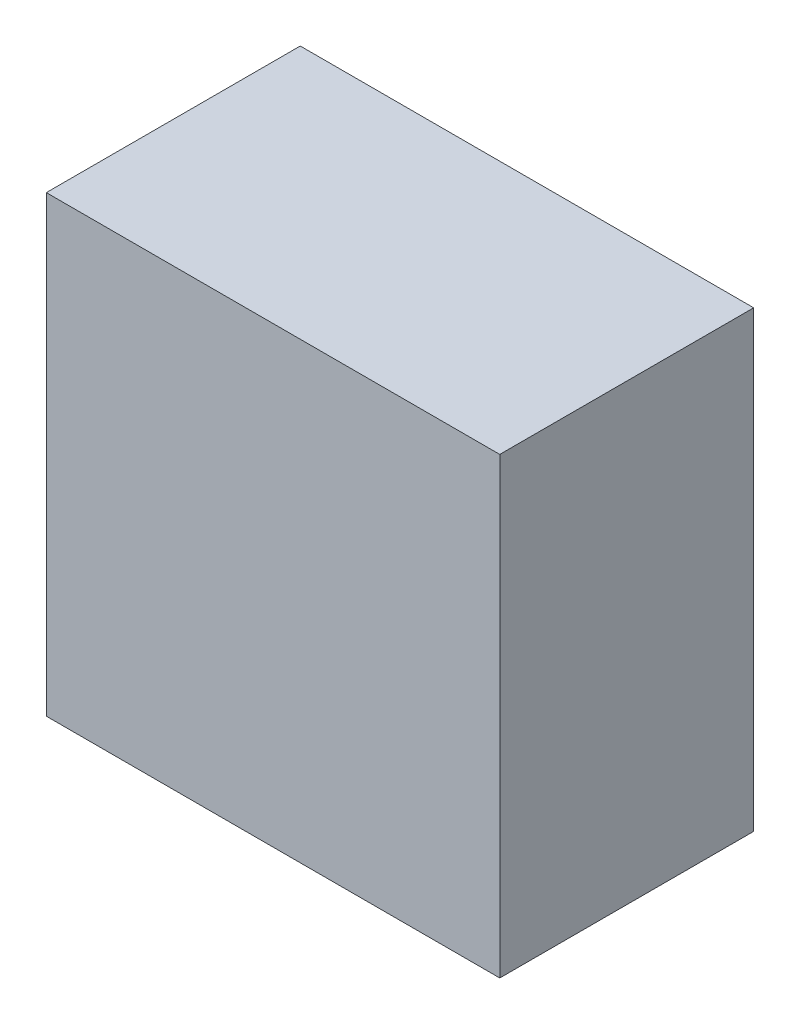
ISO-10303-21;
HEADER;
FILE_DESCRIPTION(('STEP AP214'),'2;1');
FILE_NAME('part.step','',(''),(''),'','','');
FILE_SCHEMA(('AUTOMOTIVE_DESIGN { 1 0 10303 214 1 1 1 1 }'));
ENDSEC;
DATA;
#1=APPLICATION_CONTEXT('core data for automotive mechanical design processes');
#2=APPLICATION_PROTOCOL_DEFINITION('international standard','automotive_design',2000,#1);
#3=PRODUCT_CONTEXT('',#1,'mechanical');
#4=PRODUCT('Part','Part','',(#3));
#5=PRODUCT_RELATED_PRODUCT_CATEGORY('part','',(#4));
#6=PRODUCT_DEFINITION_FORMATION('','',#4);
#7=PRODUCT_DEFINITION_CONTEXT('part definition',#1,'design');
#8=PRODUCT_DEFINITION('design','',#6,#7);
#9=PRODUCT_DEFINITION_SHAPE('','',#8);
#10=(LENGTH_UNIT() NAMED_UNIT(*) SI_UNIT(.MILLI.,.METRE.));
#11=(NAMED_UNIT(*) PLANE_ANGLE_UNIT() SI_UNIT($,.RADIAN.));
#12=(NAMED_UNIT(*) SI_UNIT($,.STERADIAN.) SOLID_ANGLE_UNIT());
#13=UNCERTAINTY_MEASURE_WITH_UNIT(LENGTH_MEASURE(1.E-05),#10,'distance_accuracy_value','');
#14=(GEOMETRIC_REPRESENTATION_CONTEXT(3) GLOBAL_UNCERTAINTY_ASSIGNED_CONTEXT((#13)) GLOBAL_UNIT_ASSIGNED_CONTEXT((#10,
#11,#12)) REPRESENTATION_CONTEXT('',''));
#15=CARTESIAN_POINT('',(0.,0.,0.));
#16=DIRECTION('',(0.,0.,1.));
#17=DIRECTION('',(1.,0.,0.));
#18=AXIS2_PLACEMENT_3D('',#15,#16,#17);
#19=CARTESIAN_POINT('',(62.5,62.5,35.));
#20=DIRECTION('',(-1.,0.,0.));
#21=DIRECTION('',(0.,-1.,0.));
#22=AXIS2_PLACEMENT_3D('',#19,#20,#21);
#23=PLANE('',#22);
#24=DIRECTION('',(0.,1.,0.));
#25=VECTOR('',#24,1.);
#26=CARTESIAN_POINT('',(62.5,62.5,-35.));
#27=LINE('',#26,#25);
#28=CARTESIAN_POINT('',(62.5,-62.5,-35.));
#29=VERTEX_POINT('',#28);
#30=CARTESIAN_POINT('',(62.5,62.5,-35.));
#31=VERTEX_POINT('',#30);
#32=EDGE_CURVE('E102',#29,#31,#27,.T.);
#33=ORIENTED_EDGE('',*,*,#32,.T.);
#34=DIRECTION('',(0.,0.,-1.));
#35=VECTOR('',#34,1.);
#36=CARTESIAN_POINT('',(62.5,62.5,35.));
#37=LINE('',#36,#35);
#38=CARTESIAN_POINT('',(62.5,62.5,35.));
#39=VERTEX_POINT('',#38);
#40=EDGE_CURVE('E11',#39,#31,#37,.T.);
#41=ORIENTED_EDGE('',*,*,#40,.F.);
#42=DIRECTION('',(0.,1.,0.));
#43=VECTOR('',#42,1.);
#44=CARTESIAN_POINT('',(62.5,62.5,35.));
#45=LINE('',#44,#43);
#46=CARTESIAN_POINT('',(62.5,-62.5,35.));
#47=VERTEX_POINT('',#46);
#48=EDGE_CURVE('E90',#47,#39,#45,.T.);
#49=ORIENTED_EDGE('',*,*,#48,.F.);
#50=DIRECTION('',(0.,0.,-1.));
#51=VECTOR('',#50,1.);
#52=CARTESIAN_POINT('',(62.5,-62.5,35.));
#53=LINE('',#52,#51);
#54=EDGE_CURVE('E98',#47,#29,#53,.T.);
#55=ORIENTED_EDGE('',*,*,#54,.T.);
#56=EDGE_LOOP('',(#33,#41,#49,#55));
#57=FACE_BOUND('',#56,.T.);
#58=ADVANCED_FACE('F39',(#57),#23,.F.);
#59=CARTESIAN_POINT('',(-62.5,62.5,35.));
#60=DIRECTION('',(0.,-1.,0.));
#61=DIRECTION('',(0.,0.,-1.));
#62=AXIS2_PLACEMENT_3D('',#59,#60,#61);
#63=PLANE('',#62);
#64=DIRECTION('',(-1.,0.,0.));
#65=VECTOR('',#64,1.);
#66=CARTESIAN_POINT('',(-62.5,62.5,-35.));
#67=LINE('',#66,#65);
#68=CARTESIAN_POINT('',(-62.5,62.5,-35.));
#69=VERTEX_POINT('',#68);
#70=EDGE_CURVE('E94',#31,#69,#67,.T.);
#71=ORIENTED_EDGE('',*,*,#70,.T.);
#72=DIRECTION('',(0.,0.,-1.));
#73=VECTOR('',#72,1.);
#74=CARTESIAN_POINT('',(-62.5,62.5,35.));
#75=LINE('',#74,#73);
#76=CARTESIAN_POINT('',(-62.5,62.5,35.));
#77=VERTEX_POINT('',#76);
#78=EDGE_CURVE('E47',#77,#69,#75,.T.);
#79=ORIENTED_EDGE('',*,*,#78,.F.);
#80=DIRECTION('',(-1.,0.,0.));
#81=VECTOR('',#80,1.);
#82=CARTESIAN_POINT('',(-62.5,62.5,35.));
#83=LINE('',#82,#81);
#84=EDGE_CURVE('E85',#39,#77,#83,.T.);
#85=ORIENTED_EDGE('',*,*,#84,.F.);
#86=ORIENTED_EDGE('',*,*,#40,.T.);
#87=EDGE_LOOP('',(#71,#79,#85,#86));
#88=FACE_BOUND('',#87,.T.);
#89=ADVANCED_FACE('F93',(#88),#63,.F.);
#90=CARTESIAN_POINT('',(-62.5,62.5,35.));
#91=DIRECTION('',(1.,0.,0.));
#92=DIRECTION('',(0.,1.,0.));
#93=AXIS2_PLACEMENT_3D('',#90,#91,#92);
#94=PLANE('',#93);
#95=DIRECTION('',(0.,-1.,0.));
#96=VECTOR('',#95,1.);
#97=CARTESIAN_POINT('',(-62.5,62.5,-35.));
#98=LINE('',#97,#96);
#99=CARTESIAN_POINT('',(-62.5,-62.5,-35.));
#100=VERTEX_POINT('',#99);
#101=EDGE_CURVE('E72',#69,#100,#98,.T.);
#102=ORIENTED_EDGE('',*,*,#101,.T.);
#103=DIRECTION('',(0.,0.,-1.));
#104=VECTOR('',#103,1.);
#105=CARTESIAN_POINT('',(-62.5,-62.5,35.));
#106=LINE('',#105,#104);
#107=CARTESIAN_POINT('',(-62.5,-62.5,35.));
#108=VERTEX_POINT('',#107);
#109=EDGE_CURVE('E95',#108,#100,#106,.T.);
#110=ORIENTED_EDGE('',*,*,#109,.F.);
#111=DIRECTION('',(0.,-1.,0.));
#112=VECTOR('',#111,1.);
#113=CARTESIAN_POINT('',(-62.5,62.5,35.));
#114=LINE('',#113,#112);
#115=EDGE_CURVE('E88',#77,#108,#114,.T.);
#116=ORIENTED_EDGE('',*,*,#115,.F.);
#117=ORIENTED_EDGE('',*,*,#78,.T.);
#118=EDGE_LOOP('',(#102,#110,#116,#117));
#119=FACE_BOUND('',#118,.T.);
#120=ADVANCED_FACE('F96',(#119),#94,.F.);
#121=CARTESIAN_POINT('',(-62.5,-62.5,35.));
#122=DIRECTION('',(0.,1.,0.));
#123=DIRECTION('',(0.,0.,1.));
#124=AXIS2_PLACEMENT_3D('',#121,#122,#123);
#125=PLANE('',#124);
#126=DIRECTION('',(1.,0.,0.));
#127=VECTOR('',#126,1.);
#128=CARTESIAN_POINT('',(-62.5,-62.5,-35.));
#129=LINE('',#128,#127);
#130=EDGE_CURVE('E78',#100,#29,#129,.T.);
#131=ORIENTED_EDGE('',*,*,#130,.T.);
#132=ORIENTED_EDGE('',*,*,#54,.F.);
#133=DIRECTION('',(1.,0.,0.));
#134=VECTOR('',#133,1.);
#135=CARTESIAN_POINT('',(-62.5,-62.5,35.));
#136=LINE('',#135,#134);
#137=EDGE_CURVE('E55',#108,#47,#136,.T.);
#138=ORIENTED_EDGE('',*,*,#137,.F.);
#139=ORIENTED_EDGE('',*,*,#109,.T.);
#140=EDGE_LOOP('',(#131,#132,#138,#139));
#141=FACE_BOUND('',#140,.T.);
#142=ADVANCED_FACE('F109',(#141),#125,.F.);
#143=CARTESIAN_POINT('',(0.,0.,35.));
#144=DIRECTION('',(0.,0.,1.));
#145=DIRECTION('',(1.,0.,0.));
#146=AXIS2_PLACEMENT_3D('',#143,#144,#145);
#147=PLANE('',#146);
#148=ORIENTED_EDGE('',*,*,#48,.T.);
#149=ORIENTED_EDGE('',*,*,#84,.T.);
#150=ORIENTED_EDGE('',*,*,#115,.T.);
#151=ORIENTED_EDGE('',*,*,#137,.T.);
#152=EDGE_LOOP('',(#148,#149,#150,#151));
#153=FACE_BOUND('',#152,.T.);
#154=ADVANCED_FACE('F86',(#153),#147,.T.);
#155=CARTESIAN_POINT('',(0.,0.,-35.));
#156=DIRECTION('',(0.,0.,1.));
#157=DIRECTION('',(1.,0.,0.));
#158=AXIS2_PLACEMENT_3D('',#155,#156,#157);
#159=PLANE('',#158);
#160=ORIENTED_EDGE('',*,*,#32,.F.);
#161=ORIENTED_EDGE('',*,*,#130,.F.);
#162=ORIENTED_EDGE('',*,*,#101,.F.);
#163=ORIENTED_EDGE('',*,*,#70,.F.);
#164=EDGE_LOOP('',(#160,#161,#162,#163));
#165=FACE_BOUND('',#164,.T.);
#166=ADVANCED_FACE('F112',(#165),#159,.F.);
#167=CLOSED_SHELL('',(#58,#89,#120,#142,#154,#166));
#168=MANIFOLD_SOLID_BREP('B2',#167);
#169=ADVANCED_BREP_SHAPE_REPRESENTATION('',(#18,#168),#14);
#170=SHAPE_DEFINITION_REPRESENTATION(#9,#169);
ENDSEC;
END-ISO-10303-21;
